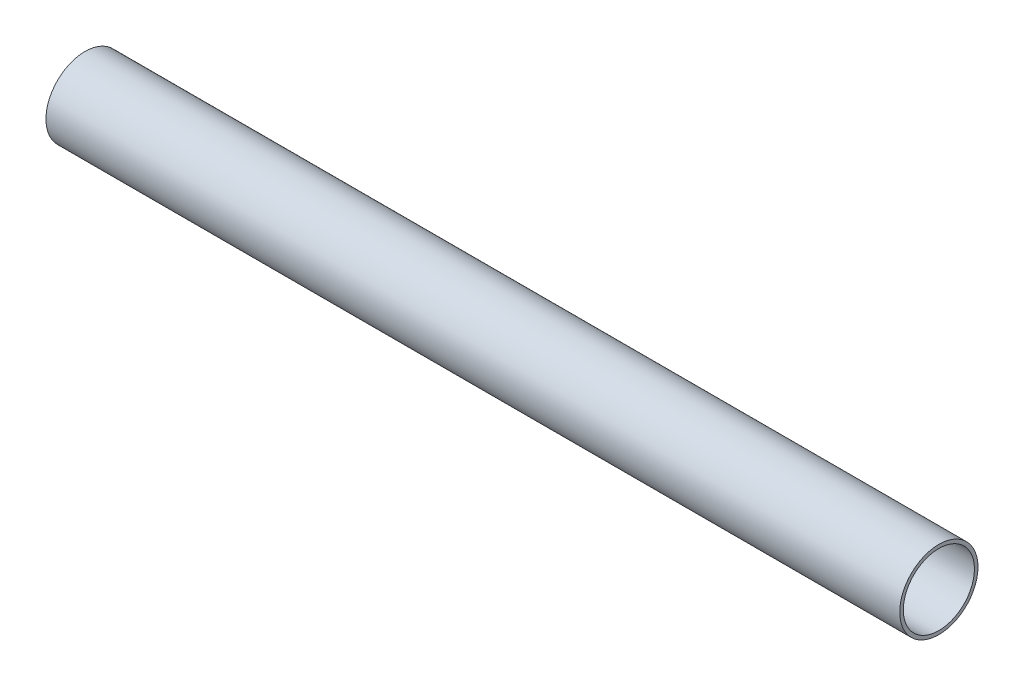
ISO-10303-21;
HEADER;
FILE_DESCRIPTION(('STEP AP214'),'2;1');
FILE_NAME('part.step','',(''),(''),'','','');
FILE_SCHEMA(('AUTOMOTIVE_DESIGN { 1 0 10303 214 1 1 1 1 }'));
ENDSEC;
DATA;
#1=APPLICATION_CONTEXT('core data for automotive mechanical design processes');
#2=APPLICATION_PROTOCOL_DEFINITION('international standard','automotive_design',2000,#1);
#3=PRODUCT_CONTEXT('',#1,'mechanical');
#4=PRODUCT('Part','Part','',(#3));
#5=PRODUCT_RELATED_PRODUCT_CATEGORY('part','',(#4));
#6=PRODUCT_DEFINITION_FORMATION('','',#4);
#7=PRODUCT_DEFINITION_CONTEXT('part definition',#1,'design');
#8=PRODUCT_DEFINITION('design','',#6,#7);
#9=PRODUCT_DEFINITION_SHAPE('','',#8);
#10=(LENGTH_UNIT() NAMED_UNIT(*) SI_UNIT(.MILLI.,.METRE.));
#11=(NAMED_UNIT(*) PLANE_ANGLE_UNIT() SI_UNIT($,.RADIAN.));
#12=(NAMED_UNIT(*) SI_UNIT($,.STERADIAN.) SOLID_ANGLE_UNIT());
#13=UNCERTAINTY_MEASURE_WITH_UNIT(LENGTH_MEASURE(1.E-05),#10,'distance_accuracy_value','');
#14=(GEOMETRIC_REPRESENTATION_CONTEXT(3) GLOBAL_UNCERTAINTY_ASSIGNED_CONTEXT((#13)) GLOBAL_UNIT_ASSIGNED_CONTEXT((#10,
#11,#12)) REPRESENTATION_CONTEXT('',''));
#15=CARTESIAN_POINT('',(0.,0.,0.));
#16=DIRECTION('',(0.,0.,1.));
#17=DIRECTION('',(1.,0.,0.));
#18=AXIS2_PLACEMENT_3D('',#15,#16,#17);
#19=CARTESIAN_POINT('',(762.,0.,0.));
#20=DIRECTION('',(1.,0.,0.));
#21=DIRECTION('',(0.,0.,-1.));
#22=AXIS2_PLACEMENT_3D('',#19,#20,#21);
#23=PLANE('',#22);
#24=CARTESIAN_POINT('',(762.,0.,0.));
#25=DIRECTION('',(1.,0.,0.));
#26=DIRECTION('',(0.,0.,-1.));
#27=AXIS2_PLACEMENT_3D('',#24,#25,#26);
#28=CIRCLE('',#27,34.925);
#29=CARTESIAN_POINT('',(762.,0.,-34.925));
#30=VERTEX_POINT('',#29);
#31=EDGE_CURVE('E10',#30,#30,#28,.T.);
#32=ORIENTED_EDGE('',*,*,#31,.T.);
#33=EDGE_LOOP('',(#32));
#34=FACE_BOUND('',#33,.T.);
#35=CARTESIAN_POINT('',(762.,0.,0.));
#36=DIRECTION('',(1.,0.,0.));
#37=DIRECTION('',(0.,0.,-1.));
#38=AXIS2_PLACEMENT_3D('',#35,#36,#37);
#39=CIRCLE('',#38,31.75);
#40=CARTESIAN_POINT('',(762.,0.,-31.75));
#41=VERTEX_POINT('',#40);
#42=EDGE_CURVE('E42',#41,#41,#39,.T.);
#43=ORIENTED_EDGE('',*,*,#42,.F.);
#44=EDGE_LOOP('',(#43));
#45=FACE_BOUND('',#44,.T.);
#46=ADVANCED_FACE('F31',(#34,#45),#23,.T.);
#47=CARTESIAN_POINT('',(0.,0.,0.));
#48=DIRECTION('',(1.,0.,0.));
#49=DIRECTION('',(0.,0.,-1.));
#50=AXIS2_PLACEMENT_3D('',#47,#48,#49);
#51=PLANE('',#50);
#52=CARTESIAN_POINT('',(0.,0.,0.));
#53=DIRECTION('',(1.,0.,0.));
#54=DIRECTION('',(0.,0.,-1.));
#55=AXIS2_PLACEMENT_3D('',#52,#53,#54);
#56=CIRCLE('',#55,34.925);
#57=CARTESIAN_POINT('',(0.,0.,-34.925));
#58=VERTEX_POINT('',#57);
#59=EDGE_CURVE('E35',#58,#58,#56,.T.);
#60=ORIENTED_EDGE('',*,*,#59,.F.);
#61=EDGE_LOOP('',(#60));
#62=FACE_BOUND('',#61,.T.);
#63=CARTESIAN_POINT('',(0.,0.,0.));
#64=DIRECTION('',(1.,0.,0.));
#65=DIRECTION('',(0.,0.,-1.));
#66=AXIS2_PLACEMENT_3D('',#63,#64,#65);
#67=CIRCLE('',#66,31.75);
#68=CARTESIAN_POINT('',(0.,0.,-31.75));
#69=VERTEX_POINT('',#68);
#70=EDGE_CURVE('E44',#69,#69,#67,.T.);
#71=ORIENTED_EDGE('',*,*,#70,.T.);
#72=EDGE_LOOP('',(#71));
#73=FACE_BOUND('',#72,.T.);
#74=ADVANCED_FACE('F54',(#62,#73),#51,.F.);
#75=CARTESIAN_POINT('',(762.,0.,0.));
#76=DIRECTION('',(-1.,0.,0.));
#77=DIRECTION('',(0.,0.,1.));
#78=AXIS2_PLACEMENT_3D('',#75,#76,#77);
#79=CYLINDRICAL_SURFACE('',#78,34.925);
#80=ORIENTED_EDGE('',*,*,#31,.F.);
#81=EDGE_LOOP('',(#80));
#82=FACE_BOUND('',#81,.T.);
#83=ORIENTED_EDGE('',*,*,#59,.T.);
#84=EDGE_LOOP('',(#83));
#85=FACE_BOUND('',#84,.T.);
#86=ADVANCED_FACE('F33',(#82,#85),#79,.T.);
#87=CARTESIAN_POINT('',(762.,0.,0.));
#88=DIRECTION('',(-1.,0.,0.));
#89=DIRECTION('',(0.,0.,1.));
#90=AXIS2_PLACEMENT_3D('',#87,#88,#89);
#91=CYLINDRICAL_SURFACE('',#90,31.75);
#92=ORIENTED_EDGE('',*,*,#42,.T.);
#93=EDGE_LOOP('',(#92));
#94=FACE_BOUND('',#93,.T.);
#95=ORIENTED_EDGE('',*,*,#70,.F.);
#96=EDGE_LOOP('',(#95));
#97=FACE_BOUND('',#96,.T.);
#98=ADVANCED_FACE('F50',(#94,#97),#91,.F.);
#99=CLOSED_SHELL('',(#46,#74,#86,#98));
#100=MANIFOLD_SOLID_BREP('B2',#99);
#101=ADVANCED_BREP_SHAPE_REPRESENTATION('',(#18,#100),#14);
#102=SHAPE_DEFINITION_REPRESENTATION(#9,#101);
ENDSEC;
END-ISO-10303-21;
